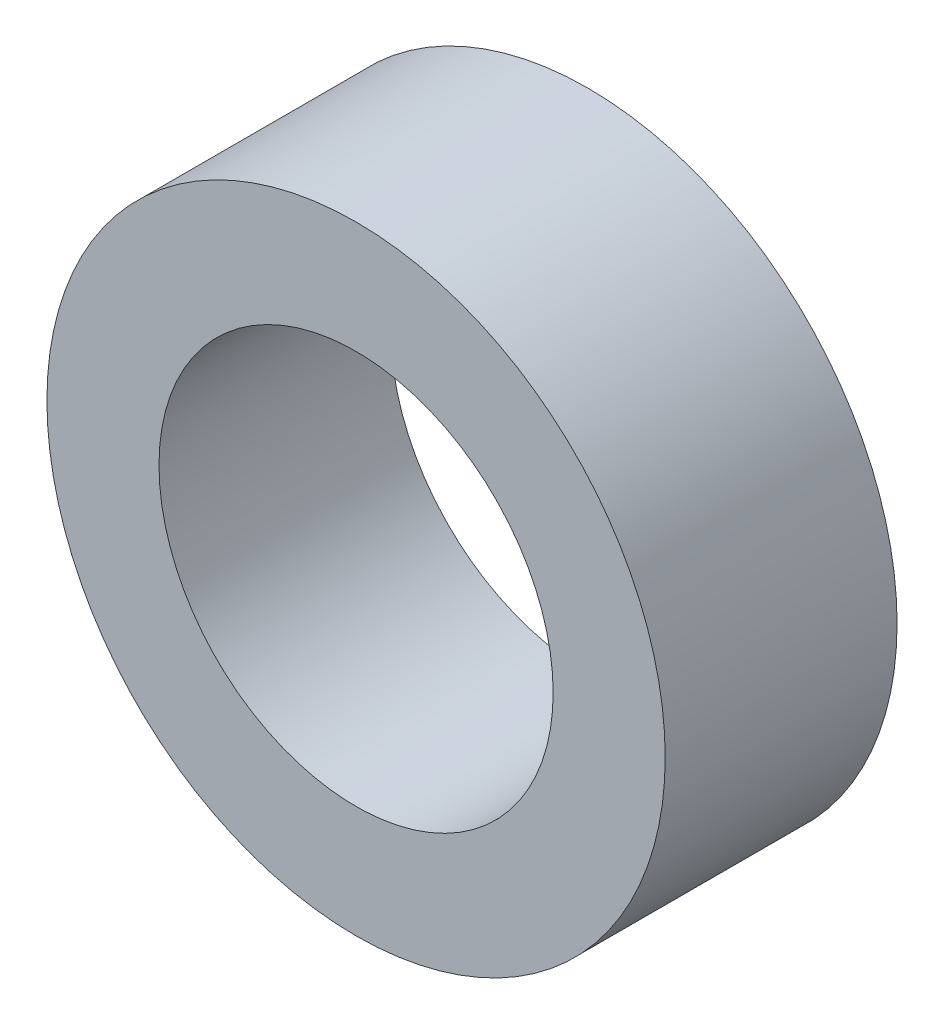
ISO-10303-21;
HEADER;
FILE_DESCRIPTION(('STEP AP214'),'2;1');
FILE_NAME('part.step','',(''),(''),'','','');
FILE_SCHEMA(('AUTOMOTIVE_DESIGN { 1 0 10303 214 1 1 1 1 }'));
ENDSEC;
DATA;
#1=APPLICATION_CONTEXT('core data for automotive mechanical design processes');
#2=APPLICATION_PROTOCOL_DEFINITION('international standard','automotive_design',2000,#1);
#3=PRODUCT_CONTEXT('',#1,'mechanical');
#4=PRODUCT('Part','Part','',(#3));
#5=PRODUCT_RELATED_PRODUCT_CATEGORY('part','',(#4));
#6=PRODUCT_DEFINITION_FORMATION('','',#4);
#7=PRODUCT_DEFINITION_CONTEXT('part definition',#1,'design');
#8=PRODUCT_DEFINITION('design','',#6,#7);
#9=PRODUCT_DEFINITION_SHAPE('','',#8);
#10=(LENGTH_UNIT() NAMED_UNIT(*) SI_UNIT(.MILLI.,.METRE.));
#11=(NAMED_UNIT(*) PLANE_ANGLE_UNIT() SI_UNIT($,.RADIAN.));
#12=(NAMED_UNIT(*) SI_UNIT($,.STERADIAN.) SOLID_ANGLE_UNIT());
#13=UNCERTAINTY_MEASURE_WITH_UNIT(LENGTH_MEASURE(1.E-05),#10,'distance_accuracy_value','');
#14=(GEOMETRIC_REPRESENTATION_CONTEXT(3) GLOBAL_UNCERTAINTY_ASSIGNED_CONTEXT((#13)) GLOBAL_UNIT_ASSIGNED_CONTEXT((#10,
#11,#12)) REPRESENTATION_CONTEXT('',''));
#15=CARTESIAN_POINT('',(0.,0.,0.));
#16=DIRECTION('',(0.,0.,1.));
#17=DIRECTION('',(1.,0.,0.));
#18=AXIS2_PLACEMENT_3D('',#15,#16,#17);
#19=CARTESIAN_POINT('',(0.,0.,6.));
#20=DIRECTION('',(0.,0.,1.));
#21=DIRECTION('',(1.,0.,0.));
#22=AXIS2_PLACEMENT_3D('',#19,#20,#21);
#23=PLANE('',#22);
#24=CARTESIAN_POINT('',(0.,0.,6.));
#25=DIRECTION('',(0.,0.,1.));
#26=DIRECTION('',(1.,0.,0.));
#27=AXIS2_PLACEMENT_3D('',#24,#25,#26);
#28=CIRCLE('',#27,8.);
#29=CARTESIAN_POINT('',(8.,0.,6.));
#30=VERTEX_POINT('',#29);
#31=EDGE_CURVE('E10',#30,#30,#28,.T.);
#32=ORIENTED_EDGE('',*,*,#31,.T.);
#33=EDGE_LOOP('',(#32));
#34=FACE_BOUND('',#33,.T.);
#35=CARTESIAN_POINT('',(0.,0.,6.));
#36=DIRECTION('',(0.,0.,1.));
#37=DIRECTION('',(1.,0.,0.));
#38=AXIS2_PLACEMENT_3D('',#35,#36,#37);
#39=CIRCLE('',#38,5.1);
#40=CARTESIAN_POINT('',(5.1,0.,6.));
#41=VERTEX_POINT('',#40);
#42=EDGE_CURVE('E43',#41,#41,#39,.T.);
#43=ORIENTED_EDGE('',*,*,#42,.F.);
#44=EDGE_LOOP('',(#43));
#45=FACE_BOUND('',#44,.T.);
#46=ADVANCED_FACE('F32',(#34,#45),#23,.T.);
#47=CARTESIAN_POINT('',(0.,0.,0.));
#48=DIRECTION('',(0.,0.,1.));
#49=DIRECTION('',(1.,0.,0.));
#50=AXIS2_PLACEMENT_3D('',#47,#48,#49);
#51=PLANE('',#50);
#52=CARTESIAN_POINT('',(0.,0.,0.));
#53=DIRECTION('',(0.,0.,1.));
#54=DIRECTION('',(1.,0.,0.));
#55=AXIS2_PLACEMENT_3D('',#52,#53,#54);
#56=CIRCLE('',#55,8.);
#57=CARTESIAN_POINT('',(8.,0.,0.));
#58=VERTEX_POINT('',#57);
#59=EDGE_CURVE('E36',#58,#58,#56,.T.);
#60=ORIENTED_EDGE('',*,*,#59,.F.);
#61=EDGE_LOOP('',(#60));
#62=FACE_BOUND('',#61,.T.);
#63=CARTESIAN_POINT('',(0.,0.,0.));
#64=DIRECTION('',(0.,0.,1.));
#65=DIRECTION('',(1.,0.,0.));
#66=AXIS2_PLACEMENT_3D('',#63,#64,#65);
#67=CIRCLE('',#66,5.1);
#68=CARTESIAN_POINT('',(5.1,0.,0.));
#69=VERTEX_POINT('',#68);
#70=EDGE_CURVE('E45',#69,#69,#67,.T.);
#71=ORIENTED_EDGE('',*,*,#70,.T.);
#72=EDGE_LOOP('',(#71));
#73=FACE_BOUND('',#72,.T.);
#74=ADVANCED_FACE('F55',(#62,#73),#51,.F.);
#75=CARTESIAN_POINT('',(0.,0.,6.));
#76=DIRECTION('',(0.,0.,-1.));
#77=DIRECTION('',(-1.,0.,0.));
#78=AXIS2_PLACEMENT_3D('',#75,#76,#77);
#79=CYLINDRICAL_SURFACE('',#78,8.);
#80=ORIENTED_EDGE('',*,*,#31,.F.);
#81=EDGE_LOOP('',(#80));
#82=FACE_BOUND('',#81,.T.);
#83=ORIENTED_EDGE('',*,*,#59,.T.);
#84=EDGE_LOOP('',(#83));
#85=FACE_BOUND('',#84,.T.);
#86=ADVANCED_FACE('F34',(#82,#85),#79,.T.);
#87=CARTESIAN_POINT('',(0.,0.,6.));
#88=DIRECTION('',(0.,0.,-1.));
#89=DIRECTION('',(-1.,0.,0.));
#90=AXIS2_PLACEMENT_3D('',#87,#88,#89);
#91=CYLINDRICAL_SURFACE('',#90,5.1);
#92=ORIENTED_EDGE('',*,*,#42,.T.);
#93=EDGE_LOOP('',(#92));
#94=FACE_BOUND('',#93,.T.);
#95=ORIENTED_EDGE('',*,*,#70,.F.);
#96=EDGE_LOOP('',(#95));
#97=FACE_BOUND('',#96,.T.);
#98=ADVANCED_FACE('F51',(#94,#97),#91,.F.);
#99=CLOSED_SHELL('',(#46,#74,#86,#98));
#100=MANIFOLD_SOLID_BREP('B2',#99);
#101=ADVANCED_BREP_SHAPE_REPRESENTATION('',(#18,#100),#14);
#102=SHAPE_DEFINITION_REPRESENTATION(#9,#101);
ENDSEC;
END-ISO-10303-21;
